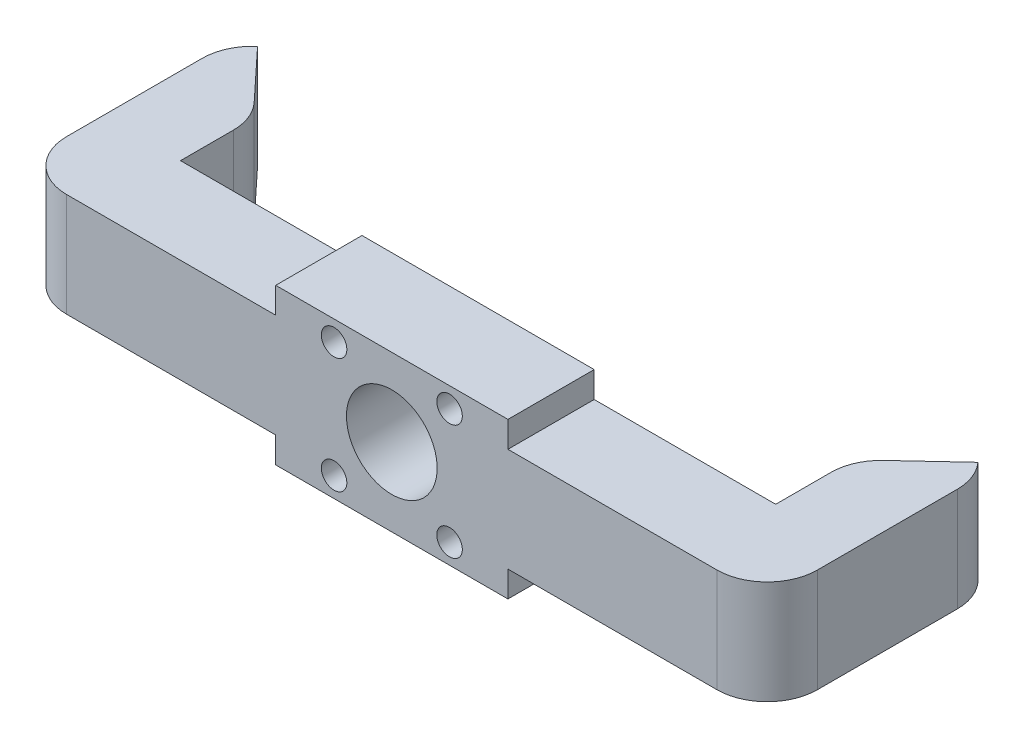
ISO-10303-21;
HEADER;
FILE_DESCRIPTION(('STEP AP214'),'2;1');
FILE_NAME('part.step','',(''),(''),'','','');
FILE_SCHEMA(('AUTOMOTIVE_DESIGN { 1 0 10303 214 1 1 1 1 }'));
ENDSEC;
DATA;
#1=APPLICATION_CONTEXT('core data for automotive mechanical design processes');
#2=APPLICATION_PROTOCOL_DEFINITION('international standard','automotive_design',2000,#1);
#3=PRODUCT_CONTEXT('',#1,'mechanical');
#4=PRODUCT('Part','Part','',(#3));
#5=PRODUCT_RELATED_PRODUCT_CATEGORY('part','',(#4));
#6=PRODUCT_DEFINITION_FORMATION('','',#4);
#7=PRODUCT_DEFINITION_CONTEXT('part definition',#1,'design');
#8=PRODUCT_DEFINITION('design','',#6,#7);
#9=PRODUCT_DEFINITION_SHAPE('','',#8);
#10=(LENGTH_UNIT() NAMED_UNIT(*) SI_UNIT(.MILLI.,.METRE.));
#11=(NAMED_UNIT(*) PLANE_ANGLE_UNIT() SI_UNIT($,.RADIAN.));
#12=(NAMED_UNIT(*) SI_UNIT($,.STERADIAN.) SOLID_ANGLE_UNIT());
#13=UNCERTAINTY_MEASURE_WITH_UNIT(LENGTH_MEASURE(1.E-05),#10,'distance_accuracy_value','');
#14=(GEOMETRIC_REPRESENTATION_CONTEXT(3) GLOBAL_UNCERTAINTY_ASSIGNED_CONTEXT((#13)) GLOBAL_UNIT_ASSIGNED_CONTEXT((#10,
#11,#12)) REPRESENTATION_CONTEXT('',''));
#15=CARTESIAN_POINT('',(0.,0.,0.));
#16=DIRECTION('',(0.,0.,1.));
#17=DIRECTION('',(1.,0.,0.));
#18=AXIS2_PLACEMENT_3D('',#15,#16,#17);
#19=CARTESIAN_POINT('',(36.7745999109079,7.62,6.56334623137176));
#20=DIRECTION('',(0.,0.,1.));
#21=DIRECTION('',(1.,0.,0.));
#22=AXIS2_PLACEMENT_3D('',#19,#20,#21);
#23=PLANE('',#22);
#24=CARTESIAN_POINT('',(-5.65685424949237,5.65685424949234,6.56334623137176));
#25=DIRECTION('',(0.,0.,-1.));
#26=DIRECTION('',(-1.,0.,0.));
#27=AXIS2_PLACEMENT_3D('',#24,#25,#26);
#28=CIRCLE('',#27,1.24999999999997);
#29=CARTESIAN_POINT('',(-6.90685424949234,5.65685424949234,6.56334623137176));
#30=VERTEX_POINT('',#29);
#31=EDGE_CURVE('E460',#30,#30,#28,.T.);
#32=ORIENTED_EDGE('',*,*,#31,.T.);
#33=EDGE_LOOP('',(#32));
#34=FACE_BOUND('',#33,.T.);
#35=CARTESIAN_POINT('',(5.65685424949239,5.65685424949234,6.56334623137176));
#36=DIRECTION('',(0.,0.,-1.));
#37=DIRECTION('',(-1.,0.,0.));
#38=AXIS2_PLACEMENT_3D('',#35,#36,#37);
#39=CIRCLE('',#38,1.24999999999997);
#40=CARTESIAN_POINT('',(4.40685424949242,5.65685424949234,6.56334623137176));
#41=VERTEX_POINT('',#40);
#42=EDGE_CURVE('E452',#41,#41,#39,.T.);
#43=ORIENTED_EDGE('',*,*,#42,.T.);
#44=EDGE_LOOP('',(#43));
#45=FACE_BOUND('',#44,.T.);
#46=CARTESIAN_POINT('',(5.65685424949239,-5.65685424949239,6.56334623137176));
#47=DIRECTION('',(0.,0.,-1.));
#48=DIRECTION('',(-1.,0.,0.));
#49=AXIS2_PLACEMENT_3D('',#46,#47,#48);
#50=CIRCLE('',#49,1.24999999999997);
#51=CARTESIAN_POINT('',(4.40685424949242,-5.65685424949239,6.56334623137176));
#52=VERTEX_POINT('',#51);
#53=EDGE_CURVE('E443',#52,#52,#50,.T.);
#54=ORIENTED_EDGE('',*,*,#53,.T.);
#55=EDGE_LOOP('',(#54));
#56=FACE_BOUND('',#55,.T.);
#57=CARTESIAN_POINT('',(-5.65685424949237,-5.65685424949239,6.56334623137176));
#58=DIRECTION('',(0.,0.,-1.));
#59=DIRECTION('',(-1.,0.,0.));
#60=AXIS2_PLACEMENT_3D('',#57,#58,#59);
#61=CIRCLE('',#60,1.24999999999997);
#62=CARTESIAN_POINT('',(-6.90685424949234,-5.65685424949239,6.56334623137176));
#63=VERTEX_POINT('',#62);
#64=EDGE_CURVE('E467',#63,#63,#61,.T.);
#65=ORIENTED_EDGE('',*,*,#64,.T.);
#66=EDGE_LOOP('',(#65));
#67=FACE_BOUND('',#66,.T.);
#68=CARTESIAN_POINT('',(0.,0.,6.56334623137176));
#69=DIRECTION('',(0.,0.,-1.));
#70=DIRECTION('',(-1.,0.,0.));
#71=AXIS2_PLACEMENT_3D('',#68,#69,#70);
#72=CIRCLE('',#71,4.445);
#73=CARTESIAN_POINT('',(-4.445,0.,6.56334623137176));
#74=VERTEX_POINT('',#73);
#75=EDGE_CURVE('E233',#74,#74,#72,.T.);
#76=ORIENTED_EDGE('',*,*,#75,.T.);
#77=EDGE_LOOP('',(#76));
#78=FACE_BOUND('',#77,.T.);
#79=DIRECTION('',(0.,-1.,0.));
#80=VECTOR('',#79,1.);
#81=CARTESIAN_POINT('',(31.8545999109078,7.62,6.56334623137176));
#82=LINE('',#81,#80);
#83=CARTESIAN_POINT('',(31.8545999109078,-5.08,6.56334623137176));
#84=VERTEX_POINT('',#83);
#85=CARTESIAN_POINT('',(31.8545999109078,5.08,6.56334623137176));
#86=VERTEX_POINT('',#85);
#87=EDGE_CURVE('E271',#84,#86,#82,.F.);
#88=ORIENTED_EDGE('',*,*,#87,.T.);
#89=DIRECTION('',(-1.,0.,0.));
#90=VECTOR('',#89,1.);
#91=CARTESIAN_POINT('',(36.7745999109078,5.08,6.56334623137176));
#92=LINE('',#91,#90);
#93=CARTESIAN_POINT('',(11.3745999109078,5.08,6.56334623137176));
#94=VERTEX_POINT('',#93);
#95=EDGE_CURVE('E204',#86,#94,#92,.T.);
#96=ORIENTED_EDGE('',*,*,#95,.T.);
#97=DIRECTION('',(0.,1.,0.));
#98=VECTOR('',#97,1.);
#99=CARTESIAN_POINT('',(11.3745999109078,5.08,6.56334623137176));
#100=LINE('',#99,#98);
#101=CARTESIAN_POINT('',(11.3745999109078,7.62,6.56334623137176));
#102=VERTEX_POINT('',#101);
#103=EDGE_CURVE('E194',#94,#102,#100,.T.);
#104=ORIENTED_EDGE('',*,*,#103,.T.);
#105=DIRECTION('',(-1.,0.,0.));
#106=VECTOR('',#105,1.);
#107=CARTESIAN_POINT('',(36.7745999109079,7.62,6.56334623137176));
#108=LINE('',#107,#106);
#109=CARTESIAN_POINT('',(-11.3745999109078,7.62,6.56334623137176));
#110=VERTEX_POINT('',#109);
#111=EDGE_CURVE('E209',#102,#110,#108,.T.);
#112=ORIENTED_EDGE('',*,*,#111,.T.);
#113=DIRECTION('',(0.,1.,0.));
#114=VECTOR('',#113,1.);
#115=CARTESIAN_POINT('',(-11.3745999109078,5.08,6.56334623137176));
#116=LINE('',#115,#114);
#117=CARTESIAN_POINT('',(-11.3745999109078,5.08,6.56334623137176));
#118=VERTEX_POINT('',#117);
#119=EDGE_CURVE('E411',#118,#110,#116,.T.);
#120=ORIENTED_EDGE('',*,*,#119,.F.);
#121=DIRECTION('',(1.,0.,0.));
#122=VECTOR('',#121,1.);
#123=CARTESIAN_POINT('',(-36.7745999109078,5.08,6.56334623137176));
#124=LINE('',#123,#122);
#125=CARTESIAN_POINT('',(-31.8545999109078,5.08,6.56334623137176));
#126=VERTEX_POINT('',#125);
#127=EDGE_CURVE('E407',#126,#118,#124,.T.);
#128=ORIENTED_EDGE('',*,*,#127,.F.);
#129=DIRECTION('',(0.,-1.,0.));
#130=VECTOR('',#129,1.);
#131=CARTESIAN_POINT('',(-31.8545999109078,7.62,6.56334623137176));
#132=LINE('',#131,#130);
#133=CARTESIAN_POINT('',(-31.8545999109078,-5.08,6.56334623137176));
#134=VERTEX_POINT('',#133);
#135=EDGE_CURVE('E267',#126,#134,#132,.T.);
#136=ORIENTED_EDGE('',*,*,#135,.T.);
#137=DIRECTION('',(1.,0.,0.));
#138=VECTOR('',#137,1.);
#139=CARTESIAN_POINT('',(-36.7745999109078,-5.08,6.56334623137176));
#140=LINE('',#139,#138);
#141=CARTESIAN_POINT('',(-11.3745999109078,-5.08,6.56334623137176));
#142=VERTEX_POINT('',#141);
#143=EDGE_CURVE('E368',#134,#142,#140,.T.);
#144=ORIENTED_EDGE('',*,*,#143,.T.);
#145=DIRECTION('',(0.,-1.,0.));
#146=VECTOR('',#145,1.);
#147=CARTESIAN_POINT('',(-11.3745999109078,-5.08,6.56334623137176));
#148=LINE('',#147,#146);
#149=CARTESIAN_POINT('',(-11.3745999109078,-7.62,6.56334623137176));
#150=VERTEX_POINT('',#149);
#151=EDGE_CURVE('E364',#142,#150,#148,.T.);
#152=ORIENTED_EDGE('',*,*,#151,.T.);
#153=DIRECTION('',(-1.,0.,0.));
#154=VECTOR('',#153,1.);
#155=CARTESIAN_POINT('',(36.7745999109079,-7.62,6.56334623137176));
#156=LINE('',#155,#154);
#157=CARTESIAN_POINT('',(11.3745999109078,-7.62,6.56334623137176));
#158=VERTEX_POINT('',#157);
#159=EDGE_CURVE('E225',#158,#150,#156,.T.);
#160=ORIENTED_EDGE('',*,*,#159,.F.);
#161=DIRECTION('',(0.,-1.,0.));
#162=VECTOR('',#161,1.);
#163=CARTESIAN_POINT('',(11.3745999109078,-5.08,6.56334623137176));
#164=LINE('',#163,#162);
#165=CARTESIAN_POINT('',(11.3745999109078,-5.08,6.56334623137176));
#166=VERTEX_POINT('',#165);
#167=EDGE_CURVE('E301',#166,#158,#164,.T.);
#168=ORIENTED_EDGE('',*,*,#167,.F.);
#169=DIRECTION('',(-1.,0.,0.));
#170=VECTOR('',#169,1.);
#171=CARTESIAN_POINT('',(36.7745999109078,-5.08,6.56334623137176));
#172=LINE('',#171,#170);
#173=EDGE_CURVE('E333',#84,#166,#172,.T.);
#174=ORIENTED_EDGE('',*,*,#173,.F.);
#175=EDGE_LOOP('',(#88,#96,#104,#112,#120,#128,#136,#144,#152,#160,#168,#174));
#176=FACE_BOUND('',#175,.T.);
#177=ADVANCED_FACE('F41',(#34,#45,#56,#67,#78,#176),#23,.T.);
#178=CARTESIAN_POINT('',(-29.1545999109078,7.62,-1.88872306662824));
#179=DIRECTION('',(0.,0.,-1.));
#180=DIRECTION('',(-1.,0.,0.));
#181=AXIS2_PLACEMENT_3D('',#178,#179,#180);
#182=PLANE('',#181);
#183=CARTESIAN_POINT('',(-5.65685424949237,5.65685424949234,-1.88872306662824));
#184=DIRECTION('',(0.,0.,-1.));
#185=DIRECTION('',(-1.,0.,0.));
#186=AXIS2_PLACEMENT_3D('',#183,#184,#185);
#187=CIRCLE('',#186,1.89999999999997);
#188=CARTESIAN_POINT('',(-7.55685424949234,5.65685424949234,-1.88872306662824));
#189=VERTEX_POINT('',#188);
#190=EDGE_CURVE('E471',#189,#189,#187,.T.);
#191=ORIENTED_EDGE('',*,*,#190,.F.);
#192=EDGE_LOOP('',(#191));
#193=FACE_BOUND('',#192,.T.);
#194=CARTESIAN_POINT('',(5.65685424949239,5.65685424949234,-1.88872306662824));
#195=DIRECTION('',(0.,0.,-1.));
#196=DIRECTION('',(-1.,0.,0.));
#197=AXIS2_PLACEMENT_3D('',#194,#195,#196);
#198=CIRCLE('',#197,1.89999999999997);
#199=CARTESIAN_POINT('',(3.75685424949242,5.65685424949234,-1.88872306662824));
#200=VERTEX_POINT('',#199);
#201=EDGE_CURVE('E488',#200,#200,#198,.T.);
#202=ORIENTED_EDGE('',*,*,#201,.F.);
#203=EDGE_LOOP('',(#202));
#204=FACE_BOUND('',#203,.T.);
#205=CARTESIAN_POINT('',(5.65685424949239,-5.65685424949239,-1.88872306662824));
#206=DIRECTION('',(0.,0.,-1.));
#207=DIRECTION('',(-1.,0.,0.));
#208=AXIS2_PLACEMENT_3D('',#205,#206,#207);
#209=CIRCLE('',#208,1.89999999999997);
#210=CARTESIAN_POINT('',(3.75685424949242,-5.65685424949239,-1.88872306662824));
#211=VERTEX_POINT('',#210);
#212=EDGE_CURVE('E480',#211,#211,#209,.T.);
#213=ORIENTED_EDGE('',*,*,#212,.F.);
#214=EDGE_LOOP('',(#213));
#215=FACE_BOUND('',#214,.T.);
#216=CARTESIAN_POINT('',(-5.65685424949237,-5.65685424949239,-1.88872306662824));
#217=DIRECTION('',(0.,0.,-1.));
#218=DIRECTION('',(-1.,0.,0.));
#219=AXIS2_PLACEMENT_3D('',#216,#217,#218);
#220=CIRCLE('',#219,1.89999999999997);
#221=CARTESIAN_POINT('',(-7.55685424949234,-5.65685424949239,-1.88872306662824));
#222=VERTEX_POINT('',#221);
#223=EDGE_CURVE('E479',#222,#222,#220,.T.);
#224=ORIENTED_EDGE('',*,*,#223,.F.);
#225=EDGE_LOOP('',(#224));
#226=FACE_BOUND('',#225,.T.);
#227=CARTESIAN_POINT('',(0.,0.,-1.88872306662824));
#228=DIRECTION('',(0.,0.,-1.));
#229=DIRECTION('',(-1.,0.,0.));
#230=AXIS2_PLACEMENT_3D('',#227,#228,#229);
#231=CIRCLE('',#230,4.445);
#232=CARTESIAN_POINT('',(-4.445,0.,-1.88872306662824));
#233=VERTEX_POINT('',#232);
#234=EDGE_CURVE('E503',#233,#233,#231,.T.);
#235=ORIENTED_EDGE('',*,*,#234,.F.);
#236=EDGE_LOOP('',(#235));
#237=FACE_BOUND('',#236,.T.);
#238=DIRECTION('',(0.,-1.,0.));
#239=VECTOR('',#238,1.);
#240=CARTESIAN_POINT('',(11.3745999109078,7.62,-1.88872306662824));
#241=LINE('',#240,#239);
#242=CARTESIAN_POINT('',(11.3745999109078,7.62,-1.88872306662824));
#243=VERTEX_POINT('',#242);
#244=CARTESIAN_POINT('',(11.3745999109078,5.08,-1.88872306662824));
#245=VERTEX_POINT('',#244);
#246=EDGE_CURVE('E197',#243,#245,#241,.T.);
#247=ORIENTED_EDGE('',*,*,#246,.T.);
#248=DIRECTION('',(1.,0.,0.));
#249=VECTOR('',#248,1.);
#250=CARTESIAN_POINT('',(-29.1545999109078,5.08,-1.88872306662824));
#251=LINE('',#250,#249);
#252=CARTESIAN_POINT('',(29.1545999109078,5.08,-1.88872306662824));
#253=VERTEX_POINT('',#252);
#254=EDGE_CURVE('E323',#245,#253,#251,.T.);
#255=ORIENTED_EDGE('',*,*,#254,.T.);
#256=DIRECTION('',(0.,-1.,0.));
#257=VECTOR('',#256,1.);
#258=CARTESIAN_POINT('',(29.1545999109078,7.62,-1.88872306662824));
#259=LINE('',#258,#257);
#260=CARTESIAN_POINT('',(29.1545999109078,-5.08,-1.88872306662824));
#261=VERTEX_POINT('',#260);
#262=EDGE_CURVE('E223',#253,#261,#259,.T.);
#263=ORIENTED_EDGE('',*,*,#262,.T.);
#264=DIRECTION('',(1.,0.,0.));
#265=VECTOR('',#264,1.);
#266=CARTESIAN_POINT('',(-29.1545999109078,-5.08,-1.88872306662824));
#267=LINE('',#266,#265);
#268=CARTESIAN_POINT('',(11.3745999109078,-5.08,-1.88872306662824));
#269=VERTEX_POINT('',#268);
#270=EDGE_CURVE('E354',#269,#261,#267,.T.);
#271=ORIENTED_EDGE('',*,*,#270,.F.);
#272=DIRECTION('',(0.,1.,0.));
#273=VECTOR('',#272,1.);
#274=CARTESIAN_POINT('',(11.3745999109078,7.62,-1.88872306662824));
#275=LINE('',#274,#273);
#276=CARTESIAN_POINT('',(11.3745999109078,-7.62,-1.88872306662824));
#277=VERTEX_POINT('',#276);
#278=EDGE_CURVE('E361',#277,#269,#275,.T.);
#279=ORIENTED_EDGE('',*,*,#278,.F.);
#280=DIRECTION('',(1.,0.,0.));
#281=VECTOR('',#280,1.);
#282=CARTESIAN_POINT('',(-29.1545999109078,-7.62,-1.88872306662824));
#283=LINE('',#282,#281);
#284=CARTESIAN_POINT('',(-11.3745999109078,-7.62,-1.88872306662824));
#285=VERTEX_POINT('',#284);
#286=EDGE_CURVE('E229',#285,#277,#283,.T.);
#287=ORIENTED_EDGE('',*,*,#286,.F.);
#288=DIRECTION('',(0.,1.,0.));
#289=VECTOR('',#288,1.);
#290=CARTESIAN_POINT('',(-11.3745999109078,7.62,-1.88872306662824));
#291=LINE('',#290,#289);
#292=CARTESIAN_POINT('',(-11.3745999109078,-5.08,-1.88872306662824));
#293=VERTEX_POINT('',#292);
#294=EDGE_CURVE('E403',#285,#293,#291,.T.);
#295=ORIENTED_EDGE('',*,*,#294,.T.);
#296=DIRECTION('',(-1.,0.,0.));
#297=VECTOR('',#296,1.);
#298=CARTESIAN_POINT('',(-29.1545999109078,-5.08,-1.88872306662824));
#299=LINE('',#298,#297);
#300=CARTESIAN_POINT('',(-29.1545999109078,-5.08,-1.88872306662824));
#301=VERTEX_POINT('',#300);
#302=EDGE_CURVE('E395',#293,#301,#299,.T.);
#303=ORIENTED_EDGE('',*,*,#302,.T.);
#304=DIRECTION('',(0.,-1.,0.));
#305=VECTOR('',#304,1.);
#306=CARTESIAN_POINT('',(-29.1545999109078,7.62,-1.88872306662824));
#307=LINE('',#306,#305);
#308=CARTESIAN_POINT('',(-29.1545999109078,5.08,-1.88872306662824));
#309=VERTEX_POINT('',#308);
#310=EDGE_CURVE('E217',#309,#301,#307,.T.);
#311=ORIENTED_EDGE('',*,*,#310,.F.);
#312=DIRECTION('',(-1.,0.,0.));
#313=VECTOR('',#312,1.);
#314=CARTESIAN_POINT('',(-29.1545999109078,5.08,-1.88872306662824));
#315=LINE('',#314,#313);
#316=CARTESIAN_POINT('',(-11.3745999109078,5.08,-1.88872306662824));
#317=VERTEX_POINT('',#316);
#318=EDGE_CURVE('E433',#317,#309,#315,.T.);
#319=ORIENTED_EDGE('',*,*,#318,.F.);
#320=DIRECTION('',(0.,-1.,0.));
#321=VECTOR('',#320,1.);
#322=CARTESIAN_POINT('',(-11.3745999109078,7.62,-1.88872306662824));
#323=LINE('',#322,#321);
#324=CARTESIAN_POINT('',(-11.3745999109078,7.62,-1.88872306662824));
#325=VERTEX_POINT('',#324);
#326=EDGE_CURVE('E439',#325,#317,#323,.T.);
#327=ORIENTED_EDGE('',*,*,#326,.F.);
#328=DIRECTION('',(1.,0.,0.));
#329=VECTOR('',#328,1.);
#330=CARTESIAN_POINT('',(-29.1545999109078,7.62,-1.88872306662824));
#331=LINE('',#330,#329);
#332=EDGE_CURVE('E218',#325,#243,#331,.T.);
#333=ORIENTED_EDGE('',*,*,#332,.T.);
#334=EDGE_LOOP('',(#247,#255,#263,#271,#279,#287,#295,#303,#311,#319,#327,#333));
#335=FACE_BOUND('',#334,.T.);
#336=ADVANCED_FACE('F515',(#193,#204,#215,#226,#237,#335),#182,.T.);
#337=CARTESIAN_POINT('',(36.7745999109078,7.62,-15.3587232406282));
#338=DIRECTION('',(1.,0.,0.));
#339=DIRECTION('',(0.,0.,-1.));
#340=AXIS2_PLACEMENT_3D('',#337,#338,#339);
#341=PLANE('',#340);
#342=DIRECTION('',(0.,1.,0.));
#343=VECTOR('',#342,1.);
#344=CARTESIAN_POINT('',(36.7745999109078,7.62,-12.0596476125166));
#345=LINE('',#344,#343);
#346=CARTESIAN_POINT('',(36.7745999109078,-5.08,-12.0596476125166));
#347=VERTEX_POINT('',#346);
#348=CARTESIAN_POINT('',(36.7745999109078,5.08,-12.0596476125166));
#349=VERTEX_POINT('',#348);
#350=EDGE_CURVE('E260',#347,#349,#345,.T.);
#351=ORIENTED_EDGE('',*,*,#350,.T.);
#352=DIRECTION('',(0.,0.,1.));
#353=VECTOR('',#352,1.);
#354=CARTESIAN_POINT('',(36.7745999109078,5.08,-15.3587232406282));
#355=LINE('',#354,#353);
#356=CARTESIAN_POINT('',(36.7745999109078,5.08,1.64334623137176));
#357=VERTEX_POINT('',#356);
#358=EDGE_CURVE('E57',#349,#357,#355,.T.);
#359=ORIENTED_EDGE('',*,*,#358,.T.);
#360=DIRECTION('',(0.,-1.,0.));
#361=VECTOR('',#360,1.);
#362=CARTESIAN_POINT('',(36.7745999109078,7.62,1.64334623137175));
#363=LINE('',#362,#361);
#364=CARTESIAN_POINT('',(36.7745999109078,-5.08,1.64334623137176));
#365=VERTEX_POINT('',#364);
#366=EDGE_CURVE('E264',#357,#365,#363,.T.);
#367=ORIENTED_EDGE('',*,*,#366,.T.);
#368=DIRECTION('',(0.,0.,1.));
#369=VECTOR('',#368,1.);
#370=CARTESIAN_POINT('',(36.7745999109078,-5.08,-15.3587232406282));
#371=LINE('',#370,#369);
#372=EDGE_CURVE('E291',#347,#365,#371,.T.);
#373=ORIENTED_EDGE('',*,*,#372,.F.);
#374=EDGE_LOOP('',(#351,#359,#367,#373));
#375=FACE_BOUND('',#374,.T.);
#376=ADVANCED_FACE('F297',(#375),#341,.T.);
#377=CARTESIAN_POINT('',(29.1545999109078,7.62,-1.88872306662824));
#378=DIRECTION('',(-1.,0.,0.));
#379=DIRECTION('',(0.,0.,1.));
#380=AXIS2_PLACEMENT_3D('',#377,#378,#379);
#381=PLANE('',#380);
#382=ORIENTED_EDGE('',*,*,#262,.F.);
#383=DIRECTION('',(0.,0.,-1.));
#384=VECTOR('',#383,1.);
#385=CARTESIAN_POINT('',(29.1545999109078,5.08,-1.88872306662824));
#386=LINE('',#385,#384);
#387=CARTESIAN_POINT('',(29.1545999109078,5.08,-7.29797555884628));
#388=VERTEX_POINT('',#387);
#389=EDGE_CURVE('E315',#253,#388,#386,.T.);
#390=ORIENTED_EDGE('',*,*,#389,.T.);
#391=DIRECTION('',(0.,1.,0.));
#392=VECTOR('',#391,1.);
#393=CARTESIAN_POINT('',(29.1545999109078,7.62,-7.29797555884628));
#394=LINE('',#393,#392);
#395=CARTESIAN_POINT('',(29.1545999109078,-5.08,-7.29797555884628));
#396=VERTEX_POINT('',#395);
#397=EDGE_CURVE('E246',#388,#396,#394,.F.);
#398=ORIENTED_EDGE('',*,*,#397,.T.);
#399=DIRECTION('',(0.,0.,-1.));
#400=VECTOR('',#399,1.);
#401=CARTESIAN_POINT('',(29.1545999109078,-5.08,-1.88872306662824));
#402=LINE('',#401,#400);
#403=EDGE_CURVE('E350',#261,#396,#402,.T.);
#404=ORIENTED_EDGE('',*,*,#403,.F.);
#405=EDGE_LOOP('',(#382,#390,#398,#404));
#406=FACE_BOUND('',#405,.T.);
#407=ADVANCED_FACE('F575',(#406),#381,.T.);
#408=CARTESIAN_POINT('',(0.,7.62,0.));
#409=DIRECTION('',(0.,-1.,0.));
#410=DIRECTION('',(0.,0.,-1.));
#411=AXIS2_PLACEMENT_3D('',#408,#409,#410);
#412=PLANE('',#411);
#413=DIRECTION('',(0.,0.,1.));
#414=VECTOR('',#413,1.);
#415=CARTESIAN_POINT('',(11.3745999109078,7.62,-15.3587232406282));
#416=LINE('',#415,#414);
#417=EDGE_CURVE('E190',#243,#102,#416,.T.);
#418=ORIENTED_EDGE('',*,*,#417,.F.);
#419=ORIENTED_EDGE('',*,*,#332,.F.);
#420=DIRECTION('',(0.,0.,1.));
#421=VECTOR('',#420,1.);
#422=CARTESIAN_POINT('',(-11.3745999109078,7.62,-15.3587232406282));
#423=LINE('',#422,#421);
#424=EDGE_CURVE('E215',#325,#110,#423,.T.);
#425=ORIENTED_EDGE('',*,*,#424,.T.);
#426=ORIENTED_EDGE('',*,*,#111,.F.);
#427=EDGE_LOOP('',(#418,#419,#425,#426));
#428=FACE_BOUND('',#427,.T.);
#429=ADVANCED_FACE('F214',(#428),#412,.F.);
#430=CARTESIAN_POINT('',(29.1545999109078,7.62,-9.43725244365408));
#431=DIRECTION('',(0.681998360062497,0.,0.731353701619171));
#432=DIRECTION('',(0.,-1.,0.));
#433=AXIS2_PLACEMENT_3D('',#430,#431,#432);
#434=PLANE('',#433);
#435=DIRECTION('',(0.,-1.,0.));
#436=VECTOR('',#435,1.);
#437=CARTESIAN_POINT('',(30.7191679794003,7.62,-10.8962357708126));
#438=LINE('',#437,#436);
#439=CARTESIAN_POINT('',(30.7191679794003,-5.08,-10.8962357708126));
#440=VERTEX_POINT('',#439);
#441=CARTESIAN_POINT('',(30.7191679794003,5.08,-10.8962357708126));
#442=VERTEX_POINT('',#441);
#443=EDGE_CURVE('E249',#440,#442,#438,.F.);
#444=ORIENTED_EDGE('',*,*,#443,.T.);
#445=DIRECTION('',(-0.731353701619171,0.,0.681998360062497));
#446=VECTOR('',#445,1.);
#447=CARTESIAN_POINT('',(29.1545999109078,5.08,-9.43725244365408));
#448=LINE('',#447,#446);
#449=CARTESIAN_POINT('',(35.5045999109078,5.08,-15.3587232406282));
#450=VERTEX_POINT('',#449);
#451=EDGE_CURVE('E305',#442,#450,#448,.F.);
#452=ORIENTED_EDGE('',*,*,#451,.T.);
#453=DIRECTION('',(0.,1.,0.));
#454=VECTOR('',#453,1.);
#455=CARTESIAN_POINT('',(35.5045999109078,7.62,-15.3587232406282));
#456=LINE('',#455,#454);
#457=CARTESIAN_POINT('',(35.5045999109078,-5.08,-15.3587232406282));
#458=VERTEX_POINT('',#457);
#459=EDGE_CURVE('E237',#458,#450,#456,.T.);
#460=ORIENTED_EDGE('',*,*,#459,.F.);
#461=DIRECTION('',(-0.731353701619171,0.,0.681998360062497));
#462=VECTOR('',#461,1.);
#463=CARTESIAN_POINT('',(29.1545999109078,-5.08,-9.43725244365408));
#464=LINE('',#463,#462);
#465=EDGE_CURVE('E64',#440,#458,#464,.F.);
#466=ORIENTED_EDGE('',*,*,#465,.F.);
#467=EDGE_LOOP('',(#444,#452,#460,#466));
#468=FACE_BOUND('',#467,.T.);
#469=ADVANCED_FACE('F308',(#468),#434,.F.);
#470=CARTESIAN_POINT('',(34.0745999109078,7.62,-7.29797555884628));
#471=DIRECTION('',(0.,1.,0.));
#472=DIRECTION('',(0.,0.,1.));
#473=AXIS2_PLACEMENT_3D('',#470,#471,#472);
#474=CYLINDRICAL_SURFACE('',#473,4.92);
#475=ORIENTED_EDGE('',*,*,#397,.F.);
#476=CARTESIAN_POINT('',(34.0745999109078,5.08,-7.29797555884628));
#477=DIRECTION('',(0.,1.,0.));
#478=DIRECTION('',(0.,0.,1.));
#479=AXIS2_PLACEMENT_3D('',#476,#477,#478);
#480=CIRCLE('',#479,4.92);
#481=EDGE_CURVE('E311',#388,#442,#480,.F.);
#482=ORIENTED_EDGE('',*,*,#481,.T.);
#483=ORIENTED_EDGE('',*,*,#443,.F.);
#484=CARTESIAN_POINT('',(34.0745999109078,-5.08,-7.29797555884628));
#485=DIRECTION('',(0.,1.,0.));
#486=DIRECTION('',(0.,0.,1.));
#487=AXIS2_PLACEMENT_3D('',#484,#485,#486);
#488=CIRCLE('',#487,4.92);
#489=EDGE_CURVE('E347',#396,#440,#488,.F.);
#490=ORIENTED_EDGE('',*,*,#489,.F.);
#491=EDGE_LOOP('',(#475,#482,#483,#490));
#492=FACE_BOUND('',#491,.T.);
#493=ADVANCED_FACE('F578',(#492),#474,.T.);
#494=CARTESIAN_POINT('',(31.8545999109078,7.62,1.64334623137176));
#495=DIRECTION('',(0.,-1.,0.));
#496=DIRECTION('',(0.,0.,-1.));
#497=AXIS2_PLACEMENT_3D('',#494,#495,#496);
#498=CYLINDRICAL_SURFACE('',#497,4.92);
#499=ORIENTED_EDGE('',*,*,#366,.F.);
#500=CARTESIAN_POINT('',(31.8545999109078,5.08,1.64334623137176));
#501=DIRECTION('',(0.,1.,0.));
#502=DIRECTION('',(0.,0.,1.));
#503=AXIS2_PLACEMENT_3D('',#500,#501,#502);
#504=CIRCLE('',#503,4.92);
#505=EDGE_CURVE('E327',#357,#86,#504,.F.);
#506=ORIENTED_EDGE('',*,*,#505,.T.);
#507=ORIENTED_EDGE('',*,*,#87,.F.);
#508=CARTESIAN_POINT('',(31.8545999109078,-5.08,1.64334623137176));
#509=DIRECTION('',(0.,1.,0.));
#510=DIRECTION('',(0.,0.,1.));
#511=AXIS2_PLACEMENT_3D('',#508,#509,#510);
#512=CIRCLE('',#511,4.92);
#513=EDGE_CURVE('E358',#365,#84,#512,.F.);
#514=ORIENTED_EDGE('',*,*,#513,.F.);
#515=EDGE_LOOP('',(#499,#506,#507,#514));
#516=FACE_BOUND('',#515,.T.);
#517=ADVANCED_FACE('F584',(#516),#498,.T.);
#518=CARTESIAN_POINT('',(31.8545999109078,7.62,-12.0596476125166));
#519=DIRECTION('',(0.,-1.,0.));
#520=DIRECTION('',(0.,0.,-1.));
#521=AXIS2_PLACEMENT_3D('',#518,#519,#520);
#522=CYLINDRICAL_SURFACE('',#521,4.92);
#523=ORIENTED_EDGE('',*,*,#459,.T.);
#524=CARTESIAN_POINT('',(31.8545999109078,5.08,-12.0596476125166));
#525=DIRECTION('',(0.,1.,0.));
#526=DIRECTION('',(0.,0.,1.));
#527=AXIS2_PLACEMENT_3D('',#524,#525,#526);
#528=CIRCLE('',#527,4.92);
#529=EDGE_CURVE('E11',#450,#349,#528,.F.);
#530=ORIENTED_EDGE('',*,*,#529,.T.);
#531=ORIENTED_EDGE('',*,*,#350,.F.);
#532=CARTESIAN_POINT('',(31.8545999109078,-5.08,-12.0596476125166));
#533=DIRECTION('',(0.,1.,0.));
#534=DIRECTION('',(0.,0.,1.));
#535=AXIS2_PLACEMENT_3D('',#532,#533,#534);
#536=CIRCLE('',#535,4.92);
#537=EDGE_CURVE('E50',#458,#347,#536,.F.);
#538=ORIENTED_EDGE('',*,*,#537,.F.);
#539=EDGE_LOOP('',(#523,#530,#531,#538));
#540=FACE_BOUND('',#539,.T.);
#541=ADVANCED_FACE('F43',(#540),#522,.T.);
#542=CARTESIAN_POINT('',(-36.7745999109079,7.62,6.56334623137176));
#543=DIRECTION('',(-1.,0.,0.));
#544=DIRECTION('',(0.,0.,1.));
#545=AXIS2_PLACEMENT_3D('',#542,#543,#544);
#546=PLANE('',#545);
#547=DIRECTION('',(0.,-1.,0.));
#548=VECTOR('',#547,1.);
#549=CARTESIAN_POINT('',(-36.7745999109078,-7.62,-11.6400506408633));
#550=LINE('',#549,#548);
#551=CARTESIAN_POINT('',(-36.7745999109078,5.08,-11.6400506408633));
#552=VERTEX_POINT('',#551);
#553=CARTESIAN_POINT('',(-36.7745999109078,-5.08,-11.6400506408633));
#554=VERTEX_POINT('',#553);
#555=EDGE_CURVE('E274',#552,#554,#550,.T.);
#556=ORIENTED_EDGE('',*,*,#555,.T.);
#557=DIRECTION('',(0.,0.,1.));
#558=VECTOR('',#557,1.);
#559=CARTESIAN_POINT('',(-36.7745999109078,-5.08,-15.3587232406282));
#560=LINE('',#559,#558);
#561=CARTESIAN_POINT('',(-36.7745999109078,-5.08,1.64334623137176));
#562=VERTEX_POINT('',#561);
#563=EDGE_CURVE('E373',#554,#562,#560,.T.);
#564=ORIENTED_EDGE('',*,*,#563,.T.);
#565=DIRECTION('',(0.,-1.,0.));
#566=VECTOR('',#565,1.);
#567=CARTESIAN_POINT('',(-36.7745999109078,7.62,1.64334623137175));
#568=LINE('',#567,#566);
#569=CARTESIAN_POINT('',(-36.7745999109078,5.08,1.64334623137176));
#570=VERTEX_POINT('',#569);
#571=EDGE_CURVE('E278',#562,#570,#568,.F.);
#572=ORIENTED_EDGE('',*,*,#571,.T.);
#573=DIRECTION('',(0.,0.,1.));
#574=VECTOR('',#573,1.);
#575=CARTESIAN_POINT('',(-36.7745999109078,5.08,-15.3587232406282));
#576=LINE('',#575,#574);
#577=EDGE_CURVE('E414',#552,#570,#576,.T.);
#578=ORIENTED_EDGE('',*,*,#577,.F.);
#579=EDGE_LOOP('',(#556,#564,#572,#578));
#580=FACE_BOUND('',#579,.T.);
#581=ADVANCED_FACE('F539',(#580),#546,.T.);
#582=CARTESIAN_POINT('',(-29.1545999109078,7.62,-15.3587232406282));
#583=DIRECTION('',(1.,0.,0.));
#584=DIRECTION('',(0.,0.,-1.));
#585=AXIS2_PLACEMENT_3D('',#582,#583,#584);
#586=PLANE('',#585);
#587=ORIENTED_EDGE('',*,*,#310,.T.);
#588=DIRECTION('',(0.,0.,-1.));
#589=VECTOR('',#588,1.);
#590=CARTESIAN_POINT('',(-29.1545999109078,-5.08,-15.3587232406282));
#591=LINE('',#590,#589);
#592=CARTESIAN_POINT('',(-29.1545999109078,-5.08,-7.07068370060268));
#593=VERTEX_POINT('',#592);
#594=EDGE_CURVE('E391',#301,#593,#591,.T.);
#595=ORIENTED_EDGE('',*,*,#594,.T.);
#596=DIRECTION('',(0.,-1.,0.));
#597=VECTOR('',#596,1.);
#598=CARTESIAN_POINT('',(-29.1545999109078,7.62,-7.07068370060268));
#599=LINE('',#598,#597);
#600=CARTESIAN_POINT('',(-29.1545999109078,5.08,-7.07068370060268));
#601=VERTEX_POINT('',#600);
#602=EDGE_CURVE('E253',#593,#601,#599,.F.);
#603=ORIENTED_EDGE('',*,*,#602,.T.);
#604=DIRECTION('',(0.,0.,-1.));
#605=VECTOR('',#604,1.);
#606=CARTESIAN_POINT('',(-29.1545999109078,5.08,-15.3587232406282));
#607=LINE('',#606,#605);
#608=EDGE_CURVE('E429',#309,#601,#607,.T.);
#609=ORIENTED_EDGE('',*,*,#608,.F.);
#610=EDGE_LOOP('',(#587,#595,#603,#609));
#611=FACE_BOUND('',#610,.T.);
#612=ADVANCED_FACE('F555',(#611),#586,.T.);
#613=CARTESIAN_POINT('',(0.,-7.62,0.));
#614=DIRECTION('',(0.,-1.,0.));
#615=DIRECTION('',(0.,0.,-1.));
#616=AXIS2_PLACEMENT_3D('',#613,#614,#615);
#617=PLANE('',#616);
#618=DIRECTION('',(0.,0.,1.));
#619=VECTOR('',#618,1.);
#620=CARTESIAN_POINT('',(11.3745999109078,-7.62,-15.3587232406282));
#621=LINE('',#620,#619);
#622=EDGE_CURVE('E339',#277,#158,#621,.T.);
#623=ORIENTED_EDGE('',*,*,#622,.T.);
#624=ORIENTED_EDGE('',*,*,#159,.T.);
#625=DIRECTION('',(0.,0.,1.));
#626=VECTOR('',#625,1.);
#627=CARTESIAN_POINT('',(-11.3745999109078,-7.62,-15.3587232406282));
#628=LINE('',#627,#626);
#629=EDGE_CURVE('E372',#285,#150,#628,.T.);
#630=ORIENTED_EDGE('',*,*,#629,.F.);
#631=ORIENTED_EDGE('',*,*,#286,.T.);
#632=EDGE_LOOP('',(#623,#624,#630,#631));
#633=FACE_BOUND('',#632,.T.);
#634=ADVANCED_FACE('F566',(#633),#617,.T.);
#635=CARTESIAN_POINT('',(-35.0760707078819,7.62,-15.3587232406282));
#636=DIRECTION('',(-0.731353701619172,0.,0.681998360062497));
#637=DIRECTION('',(0.,-1.,0.));
#638=AXIS2_PLACEMENT_3D('',#635,#636,#637);
#639=PLANE('',#638);
#640=DIRECTION('',(0.,1.,0.));
#641=VECTOR('',#640,1.);
#642=CARTESIAN_POINT('',(-30.4763396989415,7.62,-10.4261156321102));
#643=LINE('',#642,#641);
#644=CARTESIAN_POINT('',(-30.4763396989415,5.08,-10.4261156321102));
#645=VERTEX_POINT('',#644);
#646=CARTESIAN_POINT('',(-30.4763396989415,-5.08,-10.4261156321102));
#647=VERTEX_POINT('',#646);
#648=EDGE_CURVE('E256',#645,#647,#643,.F.);
#649=ORIENTED_EDGE('',*,*,#648,.T.);
#650=DIRECTION('',(0.681998360062497,0.,0.731353701619172));
#651=VECTOR('',#650,1.);
#652=CARTESIAN_POINT('',(-35.0760707078819,-5.08,-15.3587232406282));
#653=LINE('',#652,#651);
#654=CARTESIAN_POINT('',(-35.0760707078819,-5.08,-15.3587232406282));
#655=VERTEX_POINT('',#654);
#656=EDGE_CURVE('E377',#647,#655,#653,.F.);
#657=ORIENTED_EDGE('',*,*,#656,.T.);
#658=DIRECTION('',(0.,-1.,0.));
#659=VECTOR('',#658,1.);
#660=CARTESIAN_POINT('',(-35.0760707078819,7.62,-15.3587232406282));
#661=LINE('',#660,#659);
#662=CARTESIAN_POINT('',(-35.0760707078819,5.08,-15.3587232406282));
#663=VERTEX_POINT('',#662);
#664=EDGE_CURVE('E242',#663,#655,#661,.T.);
#665=ORIENTED_EDGE('',*,*,#664,.F.);
#666=DIRECTION('',(0.681998360062497,0.,0.731353701619172));
#667=VECTOR('',#666,1.);
#668=CARTESIAN_POINT('',(-35.0760707078819,5.08,-15.3587232406282));
#669=LINE('',#668,#667);
#670=EDGE_CURVE('E417',#645,#663,#669,.F.);
#671=ORIENTED_EDGE('',*,*,#670,.F.);
#672=EDGE_LOOP('',(#649,#657,#665,#671));
#673=FACE_BOUND('',#672,.T.);
#674=ADVANCED_FACE('F547',(#673),#639,.F.);
#675=CARTESIAN_POINT('',(-34.0745999109078,7.62,-7.07068370060268));
#676=DIRECTION('',(0.,-1.,0.));
#677=DIRECTION('',(0.,0.,-1.));
#678=AXIS2_PLACEMENT_3D('',#675,#676,#677);
#679=CYLINDRICAL_SURFACE('',#678,4.92);
#680=ORIENTED_EDGE('',*,*,#602,.F.);
#681=CARTESIAN_POINT('',(-34.0745999109078,-5.08,-7.07068370060268));
#682=DIRECTION('',(0.,-1.,0.));
#683=DIRECTION('',(0.,0.,-1.));
#684=AXIS2_PLACEMENT_3D('',#681,#682,#683);
#685=CIRCLE('',#684,4.92);
#686=EDGE_CURVE('E387',#593,#647,#685,.F.);
#687=ORIENTED_EDGE('',*,*,#686,.T.);
#688=ORIENTED_EDGE('',*,*,#648,.F.);
#689=CARTESIAN_POINT('',(-34.0745999109078,5.08,-7.07068370060268));
#690=DIRECTION('',(0.,-1.,0.));
#691=DIRECTION('',(0.,0.,-1.));
#692=AXIS2_PLACEMENT_3D('',#689,#690,#691);
#693=CIRCLE('',#692,4.92);
#694=EDGE_CURVE('E426',#601,#645,#693,.F.);
#695=ORIENTED_EDGE('',*,*,#694,.F.);
#696=EDGE_LOOP('',(#680,#687,#688,#695));
#697=FACE_BOUND('',#696,.T.);
#698=ADVANCED_FACE('F553',(#697),#679,.T.);
#699=CARTESIAN_POINT('',(-31.8545999109078,7.62,1.64334623137176));
#700=DIRECTION('',(0.,-1.,0.));
#701=DIRECTION('',(0.,0.,-1.));
#702=AXIS2_PLACEMENT_3D('',#699,#700,#701);
#703=CYLINDRICAL_SURFACE('',#702,4.92);
#704=ORIENTED_EDGE('',*,*,#571,.F.);
#705=CARTESIAN_POINT('',(-31.8545999109078,-5.08,1.64334623137176));
#706=DIRECTION('',(0.,-1.,0.));
#707=DIRECTION('',(0.,0.,-1.));
#708=AXIS2_PLACEMENT_3D('',#705,#706,#707);
#709=CIRCLE('',#708,4.92);
#710=EDGE_CURVE('E399',#562,#134,#709,.F.);
#711=ORIENTED_EDGE('',*,*,#710,.T.);
#712=ORIENTED_EDGE('',*,*,#135,.F.);
#713=CARTESIAN_POINT('',(-31.8545999109078,5.08,1.64334623137176));
#714=DIRECTION('',(0.,-1.,0.));
#715=DIRECTION('',(0.,0.,-1.));
#716=AXIS2_PLACEMENT_3D('',#713,#714,#715);
#717=CIRCLE('',#716,4.92);
#718=EDGE_CURVE('E436',#570,#126,#717,.F.);
#719=ORIENTED_EDGE('',*,*,#718,.F.);
#720=EDGE_LOOP('',(#704,#711,#712,#719));
#721=FACE_BOUND('',#720,.T.);
#722=ADVANCED_FACE('F535',(#721),#703,.T.);
#723=CARTESIAN_POINT('',(-31.8545999109078,7.62,-11.6400506408633));
#724=DIRECTION('',(0.,1.,0.));
#725=DIRECTION('',(0.,0.,1.));
#726=AXIS2_PLACEMENT_3D('',#723,#724,#725);
#727=CYLINDRICAL_SURFACE('',#726,4.92);
#728=ORIENTED_EDGE('',*,*,#664,.T.);
#729=CARTESIAN_POINT('',(-31.8545999109078,-5.08,-11.6400506408633));
#730=DIRECTION('',(0.,-1.,0.));
#731=DIRECTION('',(0.,0.,-1.));
#732=AXIS2_PLACEMENT_3D('',#729,#730,#731);
#733=CIRCLE('',#732,4.92);
#734=EDGE_CURVE('E284',#655,#554,#733,.F.);
#735=ORIENTED_EDGE('',*,*,#734,.T.);
#736=ORIENTED_EDGE('',*,*,#555,.F.);
#737=CARTESIAN_POINT('',(-31.8545999109078,5.08,-11.6400506408633));
#738=DIRECTION('',(0.,-1.,0.));
#739=DIRECTION('',(0.,0.,-1.));
#740=AXIS2_PLACEMENT_3D('',#737,#738,#739);
#741=CIRCLE('',#740,4.92);
#742=EDGE_CURVE('E281',#663,#552,#741,.F.);
#743=ORIENTED_EDGE('',*,*,#742,.F.);
#744=EDGE_LOOP('',(#728,#735,#736,#743));
#745=FACE_BOUND('',#744,.T.);
#746=ADVANCED_FACE('F544',(#745),#727,.T.);
#747=CARTESIAN_POINT('',(0.,0.,6.56334623137176));
#748=DIRECTION('',(0.,0.,-1.));
#749=DIRECTION('',(-1.,0.,0.));
#750=AXIS2_PLACEMENT_3D('',#747,#748,#749);
#751=CYLINDRICAL_SURFACE('',#750,4.445);
#752=ORIENTED_EDGE('',*,*,#75,.F.);
#753=EDGE_LOOP('',(#752));
#754=FACE_BOUND('',#753,.T.);
#755=ORIENTED_EDGE('',*,*,#234,.T.);
#756=EDGE_LOOP('',(#755));
#757=FACE_BOUND('',#756,.T.);
#758=ADVANCED_FACE('F513',(#754,#757),#751,.F.);
#759=CARTESIAN_POINT('',(-5.65685424949237,-5.65685424949239,3.99127695337176));
#760=DIRECTION('',(0.,0.,-1.));
#761=DIRECTION('',(-1.,0.,0.));
#762=AXIS2_PLACEMENT_3D('',#759,#760,#761);
#763=CYLINDRICAL_SURFACE('',#762,1.89999999999997);
#764=CARTESIAN_POINT('',(-5.65685424949237,-5.65685424949239,3.99127695337176));
#765=DIRECTION('',(0.,0.,-1.));
#766=DIRECTION('',(-1.,0.,0.));
#767=AXIS2_PLACEMENT_3D('',#764,#765,#766);
#768=CIRCLE('',#767,1.89999999999997);
#769=CARTESIAN_POINT('',(-7.55685424949234,-5.65685424949239,3.99127695337176));
#770=VERTEX_POINT('',#769);
#771=EDGE_CURVE('E499',#770,#770,#768,.T.);
#772=ORIENTED_EDGE('',*,*,#771,.F.);
#773=EDGE_LOOP('',(#772));
#774=FACE_BOUND('',#773,.T.);
#775=ORIENTED_EDGE('',*,*,#223,.T.);
#776=EDGE_LOOP('',(#775));
#777=FACE_BOUND('',#776,.T.);
#778=ADVANCED_FACE('F628',(#774,#777),#763,.F.);
#779=CARTESIAN_POINT('',(-5.65685424949237,-5.65685424949239,3.99127695337176));
#780=DIRECTION('',(0.,0.,-1.));
#781=DIRECTION('',(-1.,0.,0.));
#782=AXIS2_PLACEMENT_3D('',#779,#780,#781);
#783=PLANE('',#782);
#784=CARTESIAN_POINT('',(-5.65685424949237,-5.65685424949239,3.99127695337176));
#785=DIRECTION('',(0.,0.,-1.));
#786=DIRECTION('',(-1.,0.,0.));
#787=AXIS2_PLACEMENT_3D('',#784,#785,#786);
#788=CIRCLE('',#787,1.24999999999997);
#789=CARTESIAN_POINT('',(-6.90685424949234,-5.65685424949239,3.99127695337176));
#790=VERTEX_POINT('',#789);
#791=EDGE_CURVE('E447',#790,#790,#788,.T.);
#792=ORIENTED_EDGE('',*,*,#791,.F.);
#793=EDGE_LOOP('',(#792));
#794=FACE_BOUND('',#793,.T.);
#795=ORIENTED_EDGE('',*,*,#771,.T.);
#796=EDGE_LOOP('',(#795));
#797=FACE_BOUND('',#796,.T.);
#798=ADVANCED_FACE('F634',(#794,#797),#783,.T.);
#799=CARTESIAN_POINT('',(5.65685424949239,-5.65685424949239,3.99127695337176));
#800=DIRECTION('',(0.,0.,-1.));
#801=DIRECTION('',(-1.,0.,0.));
#802=AXIS2_PLACEMENT_3D('',#799,#800,#801);
#803=CYLINDRICAL_SURFACE('',#802,1.89999999999997);
#804=CARTESIAN_POINT('',(5.65685424949239,-5.65685424949239,3.99127695337176));
#805=DIRECTION('',(0.,0.,-1.));
#806=DIRECTION('',(-1.,0.,0.));
#807=AXIS2_PLACEMENT_3D('',#804,#805,#806);
#808=CIRCLE('',#807,1.89999999999997);
#809=CARTESIAN_POINT('',(3.75685424949242,-5.65685424949239,3.99127695337176));
#810=VERTEX_POINT('',#809);
#811=EDGE_CURVE('E475',#810,#810,#808,.T.);
#812=ORIENTED_EDGE('',*,*,#811,.F.);
#813=EDGE_LOOP('',(#812));
#814=FACE_BOUND('',#813,.T.);
#815=ORIENTED_EDGE('',*,*,#212,.T.);
#816=EDGE_LOOP('',(#815));
#817=FACE_BOUND('',#816,.T.);
#818=ADVANCED_FACE('F832',(#814,#817),#803,.F.);
#819=CARTESIAN_POINT('',(5.65685424949239,-5.65685424949239,3.99127695337176));
#820=DIRECTION('',(0.,0.,-1.));
#821=DIRECTION('',(-1.,0.,0.));
#822=AXIS2_PLACEMENT_3D('',#819,#820,#821);
#823=PLANE('',#822);
#824=CARTESIAN_POINT('',(5.65685424949239,-5.65685424949239,3.99127695337176));
#825=DIRECTION('',(0.,0.,-1.));
#826=DIRECTION('',(-1.,0.,0.));
#827=AXIS2_PLACEMENT_3D('',#824,#825,#826);
#828=CIRCLE('',#827,1.24999999999997);
#829=CARTESIAN_POINT('',(4.40685424949242,-5.65685424949239,3.99127695337176));
#830=VERTEX_POINT('',#829);
#831=EDGE_CURVE('E448',#830,#830,#828,.T.);
#832=ORIENTED_EDGE('',*,*,#831,.F.);
#833=EDGE_LOOP('',(#832));
#834=FACE_BOUND('',#833,.T.);
#835=ORIENTED_EDGE('',*,*,#811,.T.);
#836=EDGE_LOOP('',(#835));
#837=FACE_BOUND('',#836,.T.);
#838=ADVANCED_FACE('F827',(#834,#837),#823,.T.);
#839=CARTESIAN_POINT('',(5.65685424949239,5.65685424949234,3.99127695337176));
#840=DIRECTION('',(0.,0.,-1.));
#841=DIRECTION('',(-1.,0.,0.));
#842=AXIS2_PLACEMENT_3D('',#839,#840,#841);
#843=CYLINDRICAL_SURFACE('',#842,1.89999999999997);
#844=CARTESIAN_POINT('',(5.65685424949239,5.65685424949234,3.99127695337176));
#845=DIRECTION('',(0.,0.,-1.));
#846=DIRECTION('',(-1.,0.,0.));
#847=AXIS2_PLACEMENT_3D('',#844,#845,#846);
#848=CIRCLE('',#847,1.89999999999997);
#849=CARTESIAN_POINT('',(3.75685424949242,5.65685424949234,3.99127695337176));
#850=VERTEX_POINT('',#849);
#851=EDGE_CURVE('E484',#850,#850,#848,.T.);
#852=ORIENTED_EDGE('',*,*,#851,.F.);
#853=EDGE_LOOP('',(#852));
#854=FACE_BOUND('',#853,.T.);
#855=ORIENTED_EDGE('',*,*,#201,.T.);
#856=EDGE_LOOP('',(#855));
#857=FACE_BOUND('',#856,.T.);
#858=ADVANCED_FACE('F819',(#854,#857),#843,.F.);
#859=CARTESIAN_POINT('',(5.65685424949239,5.65685424949234,3.99127695337176));
#860=DIRECTION('',(0.,0.,-1.));
#861=DIRECTION('',(-1.,0.,0.));
#862=AXIS2_PLACEMENT_3D('',#859,#860,#861);
#863=PLANE('',#862);
#864=CARTESIAN_POINT('',(5.65685424949239,5.65685424949234,3.99127695337176));
#865=DIRECTION('',(0.,0.,-1.));
#866=DIRECTION('',(-1.,0.,0.));
#867=AXIS2_PLACEMENT_3D('',#864,#865,#866);
#868=CIRCLE('',#867,1.24999999999997);
#869=CARTESIAN_POINT('',(4.40685424949242,5.65685424949234,3.99127695337176));
#870=VERTEX_POINT('',#869);
#871=EDGE_CURVE('E456',#870,#870,#868,.T.);
#872=ORIENTED_EDGE('',*,*,#871,.F.);
#873=EDGE_LOOP('',(#872));
#874=FACE_BOUND('',#873,.T.);
#875=ORIENTED_EDGE('',*,*,#851,.T.);
#876=EDGE_LOOP('',(#875));
#877=FACE_BOUND('',#876,.T.);
#878=ADVANCED_FACE('F814',(#874,#877),#863,.T.);
#879=CARTESIAN_POINT('',(-5.65685424949237,5.65685424949234,3.99127695337176));
#880=DIRECTION('',(0.,0.,-1.));
#881=DIRECTION('',(-1.,0.,0.));
#882=AXIS2_PLACEMENT_3D('',#879,#880,#881);
#883=CYLINDRICAL_SURFACE('',#882,1.89999999999997);
#884=CARTESIAN_POINT('',(-5.65685424949237,5.65685424949234,3.99127695337176));
#885=DIRECTION('',(0.,0.,-1.));
#886=DIRECTION('',(-1.,0.,0.));
#887=AXIS2_PLACEMENT_3D('',#884,#885,#886);
#888=CIRCLE('',#887,1.89999999999997);
#889=CARTESIAN_POINT('',(-7.55685424949234,5.65685424949234,3.99127695337176));
#890=VERTEX_POINT('',#889);
#891=EDGE_CURVE('E492',#890,#890,#888,.T.);
#892=ORIENTED_EDGE('',*,*,#891,.F.);
#893=EDGE_LOOP('',(#892));
#894=FACE_BOUND('',#893,.T.);
#895=ORIENTED_EDGE('',*,*,#190,.T.);
#896=EDGE_LOOP('',(#895));
#897=FACE_BOUND('',#896,.T.);
#898=ADVANCED_FACE('F806',(#894,#897),#883,.F.);
#899=CARTESIAN_POINT('',(-5.65685424949237,5.65685424949234,3.99127695337176));
#900=DIRECTION('',(0.,0.,-1.));
#901=DIRECTION('',(-1.,0.,0.));
#902=AXIS2_PLACEMENT_3D('',#899,#900,#901);
#903=PLANE('',#902);
#904=CARTESIAN_POINT('',(-5.65685424949237,5.65685424949234,3.99127695337176));
#905=DIRECTION('',(0.,0.,-1.));
#906=DIRECTION('',(-1.,0.,0.));
#907=AXIS2_PLACEMENT_3D('',#904,#905,#906);
#908=CIRCLE('',#907,1.24999999999997);
#909=CARTESIAN_POINT('',(-6.90685424949234,5.65685424949234,3.99127695337176));
#910=VERTEX_POINT('',#909);
#911=EDGE_CURVE('E442',#910,#910,#908,.T.);
#912=ORIENTED_EDGE('',*,*,#911,.F.);
#913=EDGE_LOOP('',(#912));
#914=FACE_BOUND('',#913,.T.);
#915=ORIENTED_EDGE('',*,*,#891,.T.);
#916=EDGE_LOOP('',(#915));
#917=FACE_BOUND('',#916,.T.);
#918=ADVANCED_FACE('F796',(#914,#917),#903,.T.);
#919=CARTESIAN_POINT('',(-5.65685424949237,-5.65685424949239,6.56334623137176));
#920=DIRECTION('',(0.,0.,-1.));
#921=DIRECTION('',(-1.,0.,0.));
#922=AXIS2_PLACEMENT_3D('',#919,#920,#921);
#923=CYLINDRICAL_SURFACE('',#922,1.24999999999997);
#924=ORIENTED_EDGE('',*,*,#64,.F.);
#925=EDGE_LOOP('',(#924));
#926=FACE_BOUND('',#925,.T.);
#927=ORIENTED_EDGE('',*,*,#791,.T.);
#928=EDGE_LOOP('',(#927));
#929=FACE_BOUND('',#928,.T.);
#930=ADVANCED_FACE('F786',(#926,#929),#923,.F.);
#931=CARTESIAN_POINT('',(5.65685424949239,-5.65685424949239,6.56334623137176));
#932=DIRECTION('',(0.,0.,-1.));
#933=DIRECTION('',(-1.,0.,0.));
#934=AXIS2_PLACEMENT_3D('',#931,#932,#933);
#935=CYLINDRICAL_SURFACE('',#934,1.24999999999997);
#936=ORIENTED_EDGE('',*,*,#53,.F.);
#937=EDGE_LOOP('',(#936));
#938=FACE_BOUND('',#937,.T.);
#939=ORIENTED_EDGE('',*,*,#831,.T.);
#940=EDGE_LOOP('',(#939));
#941=FACE_BOUND('',#940,.T.);
#942=ADVANCED_FACE('F776',(#938,#941),#935,.F.);
#943=CARTESIAN_POINT('',(5.65685424949239,5.65685424949234,6.56334623137176));
#944=DIRECTION('',(0.,0.,-1.));
#945=DIRECTION('',(-1.,0.,0.));
#946=AXIS2_PLACEMENT_3D('',#943,#944,#945);
#947=CYLINDRICAL_SURFACE('',#946,1.24999999999997);
#948=ORIENTED_EDGE('',*,*,#42,.F.);
#949=EDGE_LOOP('',(#948));
#950=FACE_BOUND('',#949,.T.);
#951=ORIENTED_EDGE('',*,*,#871,.T.);
#952=EDGE_LOOP('',(#951));
#953=FACE_BOUND('',#952,.T.);
#954=ADVANCED_FACE('F766',(#950,#953),#947,.F.);
#955=CARTESIAN_POINT('',(-5.65685424949237,5.65685424949234,6.56334623137176));
#956=DIRECTION('',(0.,0.,-1.));
#957=DIRECTION('',(-1.,0.,0.));
#958=AXIS2_PLACEMENT_3D('',#955,#956,#957);
#959=CYLINDRICAL_SURFACE('',#958,1.24999999999997);
#960=ORIENTED_EDGE('',*,*,#31,.F.);
#961=EDGE_LOOP('',(#960));
#962=FACE_BOUND('',#961,.T.);
#963=ORIENTED_EDGE('',*,*,#911,.T.);
#964=EDGE_LOOP('',(#963));
#965=FACE_BOUND('',#964,.T.);
#966=ADVANCED_FACE('F757',(#962,#965),#959,.F.);
#967=CARTESIAN_POINT('',(-11.3745999109078,5.08,-15.3587232406282));
#968=DIRECTION('',(1.,0.,0.));
#969=DIRECTION('',(0.,0.,-1.));
#970=AXIS2_PLACEMENT_3D('',#967,#968,#969);
#971=PLANE('',#970);
#972=ORIENTED_EDGE('',*,*,#326,.T.);
#973=DIRECTION('',(0.,0.,1.));
#974=VECTOR('',#973,1.);
#975=CARTESIAN_POINT('',(-11.3745999109078,5.08,-15.3587232406282));
#976=LINE('',#975,#974);
#977=EDGE_CURVE('E418',#317,#118,#976,.T.);
#978=ORIENTED_EDGE('',*,*,#977,.T.);
#979=ORIENTED_EDGE('',*,*,#119,.T.);
#980=ORIENTED_EDGE('',*,*,#424,.F.);
#981=EDGE_LOOP('',(#972,#978,#979,#980));
#982=FACE_BOUND('',#981,.T.);
#983=ADVANCED_FACE('F526',(#982),#971,.F.);
#984=CARTESIAN_POINT('',(-36.7745999109078,5.08,-15.3587232406282));
#985=DIRECTION('',(0.,-1.,0.));
#986=DIRECTION('',(0.,0.,-1.));
#987=AXIS2_PLACEMENT_3D('',#984,#985,#986);
#988=PLANE('',#987);
#989=ORIENTED_EDGE('',*,*,#718,.T.);
#990=ORIENTED_EDGE('',*,*,#127,.T.);
#991=ORIENTED_EDGE('',*,*,#977,.F.);
#992=ORIENTED_EDGE('',*,*,#318,.T.);
#993=ORIENTED_EDGE('',*,*,#608,.T.);
#994=ORIENTED_EDGE('',*,*,#694,.T.);
#995=ORIENTED_EDGE('',*,*,#670,.T.);
#996=ORIENTED_EDGE('',*,*,#742,.T.);
#997=ORIENTED_EDGE('',*,*,#577,.T.);
#998=EDGE_LOOP('',(#989,#990,#991,#992,#993,#994,#995,#996,#997));
#999=FACE_BOUND('',#998,.T.);
#1000=ADVANCED_FACE('F528',(#999),#988,.F.);
#1001=CARTESIAN_POINT('',(-36.7745999109078,-5.08,-15.3587232406282));
#1002=DIRECTION('',(0.,-1.,0.));
#1003=DIRECTION('',(0.,0.,-1.));
#1004=AXIS2_PLACEMENT_3D('',#1001,#1002,#1003);
#1005=PLANE('',#1004);
#1006=ORIENTED_EDGE('',*,*,#563,.F.);
#1007=ORIENTED_EDGE('',*,*,#734,.F.);
#1008=ORIENTED_EDGE('',*,*,#656,.F.);
#1009=ORIENTED_EDGE('',*,*,#686,.F.);
#1010=ORIENTED_EDGE('',*,*,#594,.F.);
#1011=ORIENTED_EDGE('',*,*,#302,.F.);
#1012=DIRECTION('',(0.,0.,1.));
#1013=VECTOR('',#1012,1.);
#1014=CARTESIAN_POINT('',(-11.3745999109078,-5.08,-15.3587232406282));
#1015=LINE('',#1014,#1013);
#1016=EDGE_CURVE('E378',#293,#142,#1015,.T.);
#1017=ORIENTED_EDGE('',*,*,#1016,.T.);
#1018=ORIENTED_EDGE('',*,*,#143,.F.);
#1019=ORIENTED_EDGE('',*,*,#710,.F.);
#1020=EDGE_LOOP('',(#1006,#1007,#1008,#1009,#1010,#1011,#1017,#1018,#1019));
#1021=FACE_BOUND('',#1020,.T.);
#1022=ADVANCED_FACE('F537',(#1021),#1005,.T.);
#1023=CARTESIAN_POINT('',(-11.3745999109078,-5.08,-15.3587232406282));
#1024=DIRECTION('',(-1.,0.,0.));
#1025=DIRECTION('',(0.,0.,1.));
#1026=AXIS2_PLACEMENT_3D('',#1023,#1024,#1025);
#1027=PLANE('',#1026);
#1028=ORIENTED_EDGE('',*,*,#629,.T.);
#1029=ORIENTED_EDGE('',*,*,#151,.F.);
#1030=ORIENTED_EDGE('',*,*,#1016,.F.);
#1031=ORIENTED_EDGE('',*,*,#294,.F.);
#1032=EDGE_LOOP('',(#1028,#1029,#1030,#1031));
#1033=FACE_BOUND('',#1032,.T.);
#1034=ADVANCED_FACE('F560',(#1033),#1027,.T.);
#1035=CARTESIAN_POINT('',(11.3745999109078,-5.08,-15.3587232406282));
#1036=DIRECTION('',(-1.,0.,0.));
#1037=DIRECTION('',(0.,0.,1.));
#1038=AXIS2_PLACEMENT_3D('',#1035,#1036,#1037);
#1039=PLANE('',#1038);
#1040=ORIENTED_EDGE('',*,*,#278,.T.);
#1041=DIRECTION('',(0.,0.,1.));
#1042=VECTOR('',#1041,1.);
#1043=CARTESIAN_POINT('',(11.3745999109078,-5.08,-15.3587232406282));
#1044=LINE('',#1043,#1042);
#1045=EDGE_CURVE('E300',#269,#166,#1044,.T.);
#1046=ORIENTED_EDGE('',*,*,#1045,.T.);
#1047=ORIENTED_EDGE('',*,*,#167,.T.);
#1048=ORIENTED_EDGE('',*,*,#622,.F.);
#1049=EDGE_LOOP('',(#1040,#1046,#1047,#1048));
#1050=FACE_BOUND('',#1049,.T.);
#1051=ADVANCED_FACE('F569',(#1050),#1039,.F.);
#1052=CARTESIAN_POINT('',(36.7745999109078,-5.08,-15.3587232406282));
#1053=DIRECTION('',(0.,1.,0.));
#1054=DIRECTION('',(0.,0.,1.));
#1055=AXIS2_PLACEMENT_3D('',#1052,#1053,#1054);
#1056=PLANE('',#1055);
#1057=ORIENTED_EDGE('',*,*,#513,.T.);
#1058=ORIENTED_EDGE('',*,*,#173,.T.);
#1059=ORIENTED_EDGE('',*,*,#1045,.F.);
#1060=ORIENTED_EDGE('',*,*,#270,.T.);
#1061=ORIENTED_EDGE('',*,*,#403,.T.);
#1062=ORIENTED_EDGE('',*,*,#489,.T.);
#1063=ORIENTED_EDGE('',*,*,#465,.T.);
#1064=ORIENTED_EDGE('',*,*,#537,.T.);
#1065=ORIENTED_EDGE('',*,*,#372,.T.);
#1066=EDGE_LOOP('',(#1057,#1058,#1059,#1060,#1061,#1062,#1063,#1064,#1065));
#1067=FACE_BOUND('',#1066,.T.);
#1068=ADVANCED_FACE('F290',(#1067),#1056,.F.);
#1069=CARTESIAN_POINT('',(36.7745999109078,5.08,-15.3587232406282));
#1070=DIRECTION('',(0.,1.,0.));
#1071=DIRECTION('',(0.,0.,1.));
#1072=AXIS2_PLACEMENT_3D('',#1069,#1070,#1071);
#1073=PLANE('',#1072);
#1074=ORIENTED_EDGE('',*,*,#358,.F.);
#1075=ORIENTED_EDGE('',*,*,#529,.F.);
#1076=ORIENTED_EDGE('',*,*,#451,.F.);
#1077=ORIENTED_EDGE('',*,*,#481,.F.);
#1078=ORIENTED_EDGE('',*,*,#389,.F.);
#1079=ORIENTED_EDGE('',*,*,#254,.F.);
#1080=DIRECTION('',(0.,0.,1.));
#1081=VECTOR('',#1080,1.);
#1082=CARTESIAN_POINT('',(11.3745999109078,5.08,-15.3587232406282));
#1083=LINE('',#1082,#1081);
#1084=EDGE_CURVE('E203',#245,#94,#1083,.T.);
#1085=ORIENTED_EDGE('',*,*,#1084,.T.);
#1086=ORIENTED_EDGE('',*,*,#95,.F.);
#1087=ORIENTED_EDGE('',*,*,#505,.F.);
#1088=EDGE_LOOP('',(#1074,#1075,#1076,#1077,#1078,#1079,#1085,#1086,#1087));
#1089=FACE_BOUND('',#1088,.T.);
#1090=ADVANCED_FACE('F304',(#1089),#1073,.T.);
#1091=CARTESIAN_POINT('',(11.3745999109078,5.08,-15.3587232406282));
#1092=DIRECTION('',(1.,0.,0.));
#1093=DIRECTION('',(0.,0.,-1.));
#1094=AXIS2_PLACEMENT_3D('',#1091,#1092,#1093);
#1095=PLANE('',#1094);
#1096=ORIENTED_EDGE('',*,*,#417,.T.);
#1097=ORIENTED_EDGE('',*,*,#103,.F.);
#1098=ORIENTED_EDGE('',*,*,#1084,.F.);
#1099=ORIENTED_EDGE('',*,*,#246,.F.);
#1100=EDGE_LOOP('',(#1096,#1097,#1098,#1099));
#1101=FACE_BOUND('',#1100,.T.);
#1102=ADVANCED_FACE('F192',(#1101),#1095,.T.);
#1103=CLOSED_SHELL('',(#177,#336,#376,#407,#429,#469,#493,#517,#541,#581,#612,#634,#674,#698,
#722,#746,#758,#778,#798,#818,#838,#858,#878,#898,#918,#930,#942,#954,#966,#983,#1000,#1022,
#1034,#1051,#1068,#1090,#1102));
#1104=MANIFOLD_SOLID_BREP('B2',#1103);
#1105=ADVANCED_BREP_SHAPE_REPRESENTATION('',(#18,#1104),#14);
#1106=SHAPE_DEFINITION_REPRESENTATION(#9,#1105);
ENDSEC;
END-ISO-10303-21;
